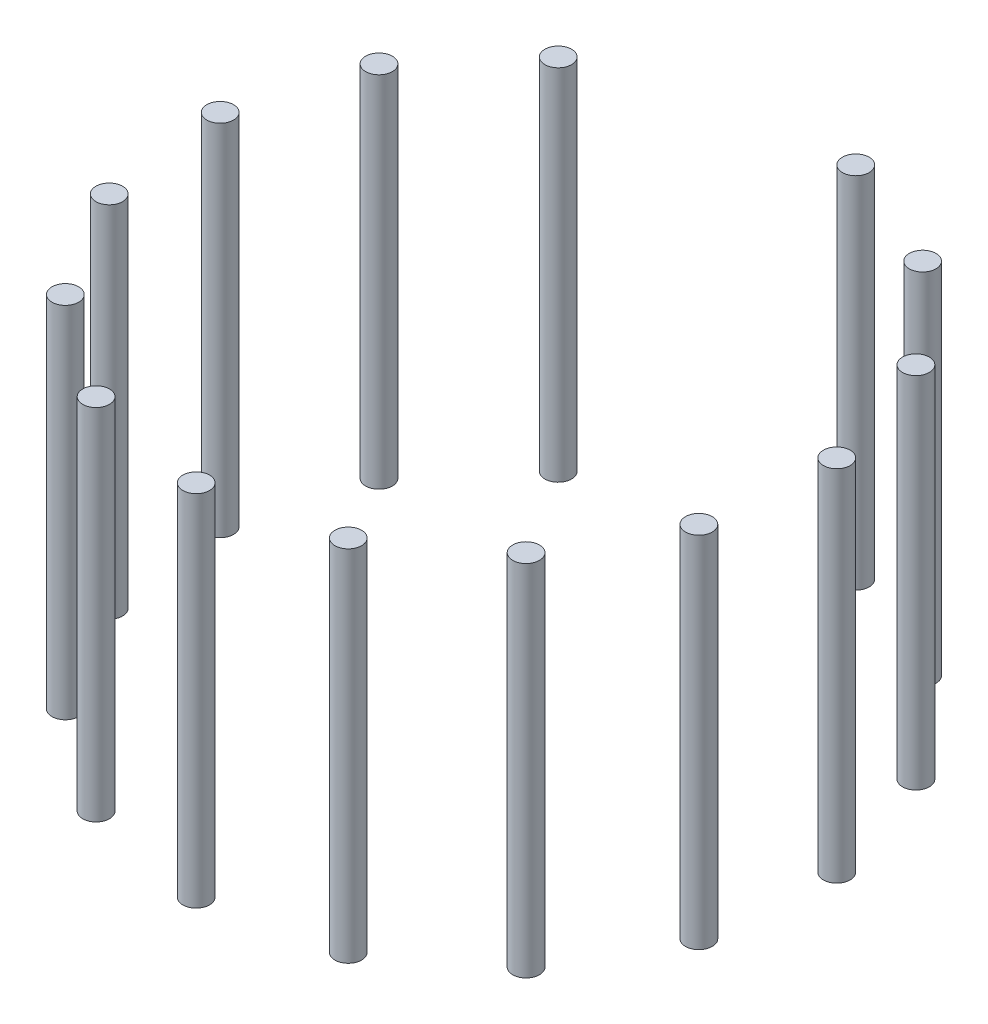
ISO-10303-21;
HEADER;
FILE_DESCRIPTION(('STEP AP214'),'2;1');
FILE_NAME('part.step','',(''),(''),'','','');
FILE_SCHEMA(('AUTOMOTIVE_DESIGN { 1 0 10303 214 1 1 1 1 }'));
ENDSEC;
DATA;
#1=APPLICATION_CONTEXT('core data for automotive mechanical design processes');
#2=APPLICATION_PROTOCOL_DEFINITION('international standard','automotive_design',2000,#1);
#3=PRODUCT_CONTEXT('',#1,'mechanical');
#4=PRODUCT('Part','Part','',(#3));
#5=PRODUCT_RELATED_PRODUCT_CATEGORY('part','',(#4));
#6=PRODUCT_DEFINITION_FORMATION('','',#4);
#7=PRODUCT_DEFINITION_CONTEXT('part definition',#1,'design');
#8=PRODUCT_DEFINITION('design','',#6,#7);
#9=PRODUCT_DEFINITION_SHAPE('','',#8);
#10=(LENGTH_UNIT() NAMED_UNIT(*) SI_UNIT(.MILLI.,.METRE.));
#11=(NAMED_UNIT(*) PLANE_ANGLE_UNIT() SI_UNIT($,.RADIAN.));
#12=(NAMED_UNIT(*) SI_UNIT($,.STERADIAN.) SOLID_ANGLE_UNIT());
#13=UNCERTAINTY_MEASURE_WITH_UNIT(LENGTH_MEASURE(1.E-05),#10,'distance_accuracy_value','');
#14=(GEOMETRIC_REPRESENTATION_CONTEXT(3) GLOBAL_UNCERTAINTY_ASSIGNED_CONTEXT((#13)) GLOBAL_UNIT_ASSIGNED_CONTEXT((#10,
#11,#12)) REPRESENTATION_CONTEXT('',''));
#15=CARTESIAN_POINT('',(0.,0.,0.));
#16=DIRECTION('',(0.,0.,1.));
#17=DIRECTION('',(1.,0.,0.));
#18=AXIS2_PLACEMENT_3D('',#15,#16,#17);
#19=CARTESIAN_POINT('',(8.83217997525082,9.4,-6.67714012740321));
#20=DIRECTION('',(0.,-1.,0.));
#21=DIRECTION('',(0.,0.,-1.));
#22=AXIS2_PLACEMENT_3D('',#19,#20,#21);
#23=CYLINDRICAL_SURFACE('',#22,0.350000000000002);
#24=CARTESIAN_POINT('',(8.83217997525082,9.4,-6.67714012740321));
#25=DIRECTION('',(0.,1.,0.));
#26=DIRECTION('',(0.,0.,1.));
#27=AXIS2_PLACEMENT_3D('',#24,#25,#26);
#28=CIRCLE('',#27,0.350000000000002);
#29=CARTESIAN_POINT('',(8.83217997525082,9.4,-6.3271401274032));
#30=VERTEX_POINT('',#29);
#31=EDGE_CURVE('E11',#30,#30,#28,.T.);
#32=ORIENTED_EDGE('',*,*,#31,.F.);
#33=EDGE_LOOP('',(#32));
#34=FACE_BOUND('',#33,.T.);
#35=CARTESIAN_POINT('',(8.83217997525082,0.,-6.67714012740321));
#36=DIRECTION('',(0.,1.,0.));
#37=DIRECTION('',(0.,0.,1.));
#38=AXIS2_PLACEMENT_3D('',#35,#36,#37);
#39=CIRCLE('',#38,0.350000000000002);
#40=CARTESIAN_POINT('',(8.83217997525082,0.,-6.3271401274032));
#41=VERTEX_POINT('',#40);
#42=EDGE_CURVE('E45',#41,#41,#39,.T.);
#43=ORIENTED_EDGE('',*,*,#42,.T.);
#44=EDGE_LOOP('',(#43));
#45=FACE_BOUND('',#44,.T.);
#46=ADVANCED_FACE('F42',(#34,#45),#23,.T.);
#47=CARTESIAN_POINT('',(8.83217997525082,9.4,-6.67714012740321));
#48=DIRECTION('',(0.,1.,0.));
#49=DIRECTION('',(0.,0.,1.));
#50=AXIS2_PLACEMENT_3D('',#47,#48,#49);
#51=PLANE('',#50);
#52=ORIENTED_EDGE('',*,*,#31,.T.);
#53=EDGE_LOOP('',(#52));
#54=FACE_BOUND('',#53,.T.);
#55=ADVANCED_FACE('F57',(#54),#51,.T.);
#56=CARTESIAN_POINT('',(8.83217997525082,0.,-6.67714012740321));
#57=DIRECTION('',(0.,1.,0.));
#58=DIRECTION('',(0.,0.,1.));
#59=AXIS2_PLACEMENT_3D('',#56,#57,#58);
#60=PLANE('',#59);
#61=ORIENTED_EDGE('',*,*,#42,.F.);
#62=EDGE_LOOP('',(#61));
#63=FACE_BOUND('',#62,.T.);
#64=ADVANCED_FACE('F55',(#63),#60,.F.);
#65=CLOSED_SHELL('',(#46,#55,#64));
#66=MANIFOLD_SOLID_BREP('B2',#65);
#67=CARTESIAN_POINT('',(6.64348952781705,9.4,-4.17198233854852));
#68=DIRECTION('',(0.,-1.,0.));
#69=DIRECTION('',(0.,0.,-1.));
#70=AXIS2_PLACEMENT_3D('',#67,#68,#69);
#71=CYLINDRICAL_SURFACE('',#70,0.350000000000001);
#72=CARTESIAN_POINT('',(6.64348952781705,9.4,-4.17198233854852));
#73=DIRECTION('',(0.,1.,0.));
#74=DIRECTION('',(0.,0.,1.));
#75=AXIS2_PLACEMENT_3D('',#72,#73,#74);
#76=CIRCLE('',#75,0.350000000000001);
#77=CARTESIAN_POINT('',(6.64348952781705,9.4,-3.82198233854852));
#78=VERTEX_POINT('',#77);
#79=EDGE_CURVE('E41',#78,#78,#76,.T.);
#80=ORIENTED_EDGE('',*,*,#79,.F.);
#81=EDGE_LOOP('',(#80));
#82=FACE_BOUND('',#81,.T.);
#83=CARTESIAN_POINT('',(6.64348952781705,0.,-4.17198233854852));
#84=DIRECTION('',(0.,1.,0.));
#85=DIRECTION('',(0.,0.,1.));
#86=AXIS2_PLACEMENT_3D('',#83,#84,#85);
#87=CIRCLE('',#86,0.350000000000001);
#88=CARTESIAN_POINT('',(6.64348952781705,0.,-3.82198233854852));
#89=VERTEX_POINT('',#88);
#90=EDGE_CURVE('E94',#89,#89,#87,.T.);
#91=ORIENTED_EDGE('',*,*,#90,.T.);
#92=EDGE_LOOP('',(#91));
#93=FACE_BOUND('',#92,.T.);
#94=ADVANCED_FACE('F91',(#82,#93),#71,.T.);
#95=CARTESIAN_POINT('',(6.64348952781705,9.4,-4.17198233854852));
#96=DIRECTION('',(0.,1.,0.));
#97=DIRECTION('',(0.,0.,1.));
#98=AXIS2_PLACEMENT_3D('',#95,#96,#97);
#99=PLANE('',#98);
#100=ORIENTED_EDGE('',*,*,#79,.T.);
#101=EDGE_LOOP('',(#100));
#102=FACE_BOUND('',#101,.T.);
#103=ADVANCED_FACE('F106',(#102),#99,.T.);
#104=CARTESIAN_POINT('',(6.64348952781705,0.,-4.17198233854852));
#105=DIRECTION('',(0.,1.,0.));
#106=DIRECTION('',(0.,0.,1.));
#107=AXIS2_PLACEMENT_3D('',#104,#105,#106);
#108=PLANE('',#107);
#109=ORIENTED_EDGE('',*,*,#90,.F.);
#110=EDGE_LOOP('',(#109));
#111=FACE_BOUND('',#110,.T.);
#112=ADVANCED_FACE('F104',(#111),#108,.F.);
#113=CLOSED_SHELL('',(#94,#103,#112));
#114=MANIFOLD_SOLID_BREP('B6',#113);
#115=CARTESIAN_POINT('',(5.66296078079213,9.4,-0.993186214541055));
#116=DIRECTION('',(0.,-1.,0.));
#117=DIRECTION('',(0.,0.,-1.));
#118=AXIS2_PLACEMENT_3D('',#115,#116,#117);
#119=CYLINDRICAL_SURFACE('',#118,0.35);
#120=CARTESIAN_POINT('',(5.66296078079213,9.4,-0.993186214541055));
#121=DIRECTION('',(0.,1.,0.));
#122=DIRECTION('',(0.,0.,1.));
#123=AXIS2_PLACEMENT_3D('',#120,#121,#122);
#124=CIRCLE('',#123,0.35);
#125=CARTESIAN_POINT('',(5.66296078079213,9.4,-0.643186214541055));
#126=VERTEX_POINT('',#125);
#127=EDGE_CURVE('E90',#126,#126,#124,.T.);
#128=ORIENTED_EDGE('',*,*,#127,.F.);
#129=EDGE_LOOP('',(#128));
#130=FACE_BOUND('',#129,.T.);
#131=CARTESIAN_POINT('',(5.66296078079213,0.,-0.993186214541055));
#132=DIRECTION('',(0.,1.,0.));
#133=DIRECTION('',(0.,0.,1.));
#134=AXIS2_PLACEMENT_3D('',#131,#132,#133);
#135=CIRCLE('',#134,0.35);
#136=CARTESIAN_POINT('',(5.66296078079213,0.,-0.643186214541055));
#137=VERTEX_POINT('',#136);
#138=EDGE_CURVE('E143',#137,#137,#135,.T.);
#139=ORIENTED_EDGE('',*,*,#138,.T.);
#140=EDGE_LOOP('',(#139));
#141=FACE_BOUND('',#140,.T.);
#142=ADVANCED_FACE('F140',(#130,#141),#119,.T.);
#143=CARTESIAN_POINT('',(5.66296078079213,9.4,-0.993186214541055));
#144=DIRECTION('',(0.,1.,0.));
#145=DIRECTION('',(0.,0.,1.));
#146=AXIS2_PLACEMENT_3D('',#143,#144,#145);
#147=PLANE('',#146);
#148=ORIENTED_EDGE('',*,*,#127,.T.);
#149=EDGE_LOOP('',(#148));
#150=FACE_BOUND('',#149,.T.);
#151=ADVANCED_FACE('F155',(#150),#147,.T.);
#152=CARTESIAN_POINT('',(5.66296078079213,0.,-0.993186214541055));
#153=DIRECTION('',(0.,1.,0.));
#154=DIRECTION('',(0.,0.,1.));
#155=AXIS2_PLACEMENT_3D('',#152,#153,#154);
#156=PLANE('',#155);
#157=ORIENTED_EDGE('',*,*,#138,.F.);
#158=EDGE_LOOP('',(#157));
#159=FACE_BOUND('',#158,.T.);
#160=ADVANCED_FACE('F153',(#159),#156,.F.);
#161=CLOSED_SHELL('',(#142,#151,#160));
#162=MANIFOLD_SOLID_BREP('B36',#161);
#163=CARTESIAN_POINT('',(6.06013606236068,9.4,2.3096055163221));
#164=DIRECTION('',(0.,-1.,0.));
#165=DIRECTION('',(0.,0.,-1.));
#166=AXIS2_PLACEMENT_3D('',#163,#164,#165);
#167=CYLINDRICAL_SURFACE('',#166,0.35);
#168=CARTESIAN_POINT('',(6.06013606236068,9.4,2.3096055163221));
#169=DIRECTION('',(0.,1.,0.));
#170=DIRECTION('',(0.,0.,1.));
#171=AXIS2_PLACEMENT_3D('',#168,#169,#170);
#172=CIRCLE('',#171,0.35);
#173=CARTESIAN_POINT('',(6.06013606236068,9.4,2.6596055163221));
#174=VERTEX_POINT('',#173);
#175=EDGE_CURVE('E139',#174,#174,#172,.T.);
#176=ORIENTED_EDGE('',*,*,#175,.F.);
#177=EDGE_LOOP('',(#176));
#178=FACE_BOUND('',#177,.T.);
#179=CARTESIAN_POINT('',(6.06013606236068,0.,2.3096055163221));
#180=DIRECTION('',(0.,1.,0.));
#181=DIRECTION('',(0.,0.,1.));
#182=AXIS2_PLACEMENT_3D('',#179,#180,#181);
#183=CIRCLE('',#182,0.35);
#184=CARTESIAN_POINT('',(6.06013606236068,0.,2.6596055163221));
#185=VERTEX_POINT('',#184);
#186=EDGE_CURVE('E192',#185,#185,#183,.T.);
#187=ORIENTED_EDGE('',*,*,#186,.T.);
#188=EDGE_LOOP('',(#187));
#189=FACE_BOUND('',#188,.T.);
#190=ADVANCED_FACE('F189',(#178,#189),#167,.T.);
#191=CARTESIAN_POINT('',(6.06013606236068,9.4,2.3096055163221));
#192=DIRECTION('',(0.,1.,0.));
#193=DIRECTION('',(0.,0.,1.));
#194=AXIS2_PLACEMENT_3D('',#191,#192,#193);
#195=PLANE('',#194);
#196=ORIENTED_EDGE('',*,*,#175,.T.);
#197=EDGE_LOOP('',(#196));
#198=FACE_BOUND('',#197,.T.);
#199=ADVANCED_FACE('F204',(#198),#195,.T.);
#200=CARTESIAN_POINT('',(6.06013606236068,0.,2.3096055163221));
#201=DIRECTION('',(0.,1.,0.));
#202=DIRECTION('',(0.,0.,1.));
#203=AXIS2_PLACEMENT_3D('',#200,#201,#202);
#204=PLANE('',#203);
#205=ORIENTED_EDGE('',*,*,#186,.F.);
#206=EDGE_LOOP('',(#205));
#207=FACE_BOUND('',#206,.T.);
#208=ADVANCED_FACE('F202',(#207),#204,.F.);
#209=CLOSED_SHELL('',(#190,#199,#208));
#210=MANIFOLD_SOLID_BREP('B85',#209);
#211=CARTESIAN_POINT('',(7.76634015811535,9.4,5.1653101588538));
#212=DIRECTION('',(0.,-1.,0.));
#213=DIRECTION('',(0.,0.,-1.));
#214=AXIS2_PLACEMENT_3D('',#211,#212,#213);
#215=CYLINDRICAL_SURFACE('',#214,0.349999999999999);
#216=CARTESIAN_POINT('',(7.76634015811535,9.4,5.1653101588538));
#217=DIRECTION('',(0.,1.,0.));
#218=DIRECTION('',(0.,0.,1.));
#219=AXIS2_PLACEMENT_3D('',#216,#217,#218);
#220=CIRCLE('',#219,0.349999999999999);
#221=CARTESIAN_POINT('',(7.76634015811535,9.4,5.5153101588538));
#222=VERTEX_POINT('',#221);
#223=EDGE_CURVE('E188',#222,#222,#220,.T.);
#224=ORIENTED_EDGE('',*,*,#223,.F.);
#225=EDGE_LOOP('',(#224));
#226=FACE_BOUND('',#225,.T.);
#227=CARTESIAN_POINT('',(7.76634015811535,0.,5.1653101588538));
#228=DIRECTION('',(0.,1.,0.));
#229=DIRECTION('',(0.,0.,1.));
#230=AXIS2_PLACEMENT_3D('',#227,#228,#229);
#231=CIRCLE('',#230,0.349999999999999);
#232=CARTESIAN_POINT('',(7.76634015811535,0.,5.5153101588538));
#233=VERTEX_POINT('',#232);
#234=EDGE_CURVE('E241',#233,#233,#231,.T.);
#235=ORIENTED_EDGE('',*,*,#234,.T.);
#236=EDGE_LOOP('',(#235));
#237=FACE_BOUND('',#236,.T.);
#238=ADVANCED_FACE('F238',(#226,#237),#215,.T.);
#239=CARTESIAN_POINT('',(7.76634015811535,9.4,5.1653101588538));
#240=DIRECTION('',(0.,1.,0.));
#241=DIRECTION('',(0.,0.,1.));
#242=AXIS2_PLACEMENT_3D('',#239,#240,#241);
#243=PLANE('',#242);
#244=ORIENTED_EDGE('',*,*,#223,.T.);
#245=EDGE_LOOP('',(#244));
#246=FACE_BOUND('',#245,.T.);
#247=ADVANCED_FACE('F253',(#246),#243,.T.);
#248=CARTESIAN_POINT('',(7.76634015811535,0.,5.1653101588538));
#249=DIRECTION('',(0.,1.,0.));
#250=DIRECTION('',(0.,0.,1.));
#251=AXIS2_PLACEMENT_3D('',#248,#249,#250);
#252=PLANE('',#251);
#253=ORIENTED_EDGE('',*,*,#234,.F.);
#254=EDGE_LOOP('',(#253));
#255=FACE_BOUND('',#254,.T.);
#256=ADVANCED_FACE('F251',(#255),#252,.F.);
#257=CLOSED_SHELL('',(#238,#247,#256));
#258=MANIFOLD_SOLID_BREP('B134',#257);
#259=CARTESIAN_POINT('',(10.4865548795226,9.4,7.08015043709809));
#260=DIRECTION('',(0.,-1.,0.));
#261=DIRECTION('',(0.,0.,-1.));
#262=AXIS2_PLACEMENT_3D('',#259,#260,#261);
#263=CYLINDRICAL_SURFACE('',#262,0.35);
#264=CARTESIAN_POINT('',(10.4865548795226,9.4,7.08015043709809));
#265=DIRECTION('',(0.,1.,0.));
#266=DIRECTION('',(0.,0.,1.));
#267=AXIS2_PLACEMENT_3D('',#264,#265,#266);
#268=CIRCLE('',#267,0.35);
#269=CARTESIAN_POINT('',(10.4865548795226,9.4,7.43015043709809));
#270=VERTEX_POINT('',#269);
#271=EDGE_CURVE('E237',#270,#270,#268,.T.);
#272=ORIENTED_EDGE('',*,*,#271,.F.);
#273=EDGE_LOOP('',(#272));
#274=FACE_BOUND('',#273,.T.);
#275=CARTESIAN_POINT('',(10.4865548795226,0.,7.08015043709809));
#276=DIRECTION('',(0.,1.,0.));
#277=DIRECTION('',(0.,0.,1.));
#278=AXIS2_PLACEMENT_3D('',#275,#276,#277);
#279=CIRCLE('',#278,0.35);
#280=CARTESIAN_POINT('',(10.4865548795226,0.,7.43015043709809));
#281=VERTEX_POINT('',#280);
#282=EDGE_CURVE('E290',#281,#281,#279,.T.);
#283=ORIENTED_EDGE('',*,*,#282,.T.);
#284=EDGE_LOOP('',(#283));
#285=FACE_BOUND('',#284,.T.);
#286=ADVANCED_FACE('F287',(#274,#285),#263,.T.);
#287=CARTESIAN_POINT('',(10.4865548795226,9.4,7.08015043709809));
#288=DIRECTION('',(0.,1.,0.));
#289=DIRECTION('',(0.,0.,1.));
#290=AXIS2_PLACEMENT_3D('',#287,#288,#289);
#291=PLANE('',#290);
#292=ORIENTED_EDGE('',*,*,#271,.T.);
#293=EDGE_LOOP('',(#292));
#294=FACE_BOUND('',#293,.T.);
#295=ADVANCED_FACE('F302',(#294),#291,.T.);
#296=CARTESIAN_POINT('',(10.4865548795226,0.,7.08015043709809));
#297=DIRECTION('',(0.,1.,0.));
#298=DIRECTION('',(0.,0.,1.));
#299=AXIS2_PLACEMENT_3D('',#296,#297,#298);
#300=PLANE('',#299);
#301=ORIENTED_EDGE('',*,*,#282,.F.);
#302=EDGE_LOOP('',(#301));
#303=FACE_BOUND('',#302,.T.);
#304=ADVANCED_FACE('F300',(#303),#300,.F.);
#305=CLOSED_SHELL('',(#286,#295,#304));
#306=MANIFOLD_SOLID_BREP('B183',#305);
#307=CARTESIAN_POINT('',(13.7504303888761,9.4,7.72303307116871));
#308=DIRECTION('',(0.,-1.,0.));
#309=DIRECTION('',(0.,0.,-1.));
#310=AXIS2_PLACEMENT_3D('',#307,#308,#309);
#311=CYLINDRICAL_SURFACE('',#310,0.349999999999999);
#312=CARTESIAN_POINT('',(13.7504303888761,9.4,7.72303307116871));
#313=DIRECTION('',(0.,1.,0.));
#314=DIRECTION('',(0.,0.,1.));
#315=AXIS2_PLACEMENT_3D('',#312,#313,#314);
#316=CIRCLE('',#315,0.349999999999999);
#317=CARTESIAN_POINT('',(13.7504303888761,9.4,8.07303307116871));
#318=VERTEX_POINT('',#317);
#319=EDGE_CURVE('E286',#318,#318,#316,.T.);
#320=ORIENTED_EDGE('',*,*,#319,.F.);
#321=EDGE_LOOP('',(#320));
#322=FACE_BOUND('',#321,.T.);
#323=CARTESIAN_POINT('',(13.7504303888761,0.,7.72303307116871));
#324=DIRECTION('',(0.,1.,0.));
#325=DIRECTION('',(0.,0.,1.));
#326=AXIS2_PLACEMENT_3D('',#323,#324,#325);
#327=CIRCLE('',#326,0.349999999999999);
#328=CARTESIAN_POINT('',(13.7504303888761,0.,8.07303307116871));
#329=VERTEX_POINT('',#328);
#330=EDGE_CURVE('E339',#329,#329,#327,.T.);
#331=ORIENTED_EDGE('',*,*,#330,.T.);
#332=EDGE_LOOP('',(#331));
#333=FACE_BOUND('',#332,.T.);
#334=ADVANCED_FACE('F336',(#322,#333),#311,.T.);
#335=CARTESIAN_POINT('',(13.7504303888761,9.4,7.72303307116871));
#336=DIRECTION('',(0.,1.,0.));
#337=DIRECTION('',(0.,0.,1.));
#338=AXIS2_PLACEMENT_3D('',#335,#336,#337);
#339=PLANE('',#338);
#340=ORIENTED_EDGE('',*,*,#319,.T.);
#341=EDGE_LOOP('',(#340));
#342=FACE_BOUND('',#341,.T.);
#343=ADVANCED_FACE('F351',(#342),#339,.T.);
#344=CARTESIAN_POINT('',(13.7504303888761,0.,7.72303307116871));
#345=DIRECTION('',(0.,1.,0.));
#346=DIRECTION('',(0.,0.,1.));
#347=AXIS2_PLACEMENT_3D('',#344,#345,#346);
#348=PLANE('',#347);
#349=ORIENTED_EDGE('',*,*,#330,.F.);
#350=EDGE_LOOP('',(#349));
#351=FACE_BOUND('',#350,.T.);
#352=ADVANCED_FACE('F349',(#351),#348,.F.);
#353=CLOSED_SHELL('',(#334,#343,#352));
#354=MANIFOLD_SOLID_BREP('B232',#353);
#355=CARTESIAN_POINT('',(16.9936129592305,9.4,6.98279781322947));
#356=DIRECTION('',(0.,-1.,0.));
#357=DIRECTION('',(0.,0.,-1.));
#358=AXIS2_PLACEMENT_3D('',#355,#356,#357);
#359=CYLINDRICAL_SURFACE('',#358,0.350000000000003);
#360=CARTESIAN_POINT('',(16.9936129592305,9.4,6.98279781322947));
#361=DIRECTION('',(0.,1.,0.));
#362=DIRECTION('',(0.,0.,1.));
#363=AXIS2_PLACEMENT_3D('',#360,#361,#362);
#364=CIRCLE('',#363,0.350000000000003);
#365=CARTESIAN_POINT('',(16.9936129592305,9.4,7.33279781322947));
#366=VERTEX_POINT('',#365);
#367=EDGE_CURVE('E335',#366,#366,#364,.T.);
#368=ORIENTED_EDGE('',*,*,#367,.F.);
#369=EDGE_LOOP('',(#368));
#370=FACE_BOUND('',#369,.T.);
#371=CARTESIAN_POINT('',(16.9936129592305,0.,6.98279781322947));
#372=DIRECTION('',(0.,1.,0.));
#373=DIRECTION('',(0.,0.,1.));
#374=AXIS2_PLACEMENT_3D('',#371,#372,#373);
#375=CIRCLE('',#374,0.350000000000003);
#376=CARTESIAN_POINT('',(16.9936129592305,0.,7.33279781322947));
#377=VERTEX_POINT('',#376);
#378=EDGE_CURVE('E388',#377,#377,#375,.T.);
#379=ORIENTED_EDGE('',*,*,#378,.T.);
#380=EDGE_LOOP('',(#379));
#381=FACE_BOUND('',#380,.T.);
#382=ADVANCED_FACE('F385',(#370,#381),#359,.T.);
#383=CARTESIAN_POINT('',(16.9936129592305,9.4,6.98279781322947));
#384=DIRECTION('',(0.,1.,0.));
#385=DIRECTION('',(0.,0.,1.));
#386=AXIS2_PLACEMENT_3D('',#383,#384,#385);
#387=PLANE('',#386);
#388=ORIENTED_EDGE('',*,*,#367,.T.);
#389=EDGE_LOOP('',(#388));
#390=FACE_BOUND('',#389,.T.);
#391=ADVANCED_FACE('F400',(#390),#387,.T.);
#392=CARTESIAN_POINT('',(16.9936129592305,0.,6.98279781322947));
#393=DIRECTION('',(0.,1.,0.));
#394=DIRECTION('',(0.,0.,1.));
#395=AXIS2_PLACEMENT_3D('',#392,#393,#394);
#396=PLANE('',#395);
#397=ORIENTED_EDGE('',*,*,#378,.F.);
#398=EDGE_LOOP('',(#397));
#399=FACE_BOUND('',#398,.T.);
#400=ADVANCED_FACE('F398',(#399),#396,.F.);
#401=CLOSED_SHELL('',(#382,#391,#400));
#402=MANIFOLD_SOLID_BREP('B281',#401);
#403=CARTESIAN_POINT('',(19.6553268607829,9.4,4.98743806420427));
#404=DIRECTION('',(0.,-1.,0.));
#405=DIRECTION('',(0.,0.,-1.));
#406=AXIS2_PLACEMENT_3D('',#403,#404,#405);
#407=CYLINDRICAL_SURFACE('',#406,0.349999999999999);
#408=CARTESIAN_POINT('',(19.6553268607829,9.4,4.98743806420427));
#409=DIRECTION('',(0.,1.,0.));
#410=DIRECTION('',(0.,0.,1.));
#411=AXIS2_PLACEMENT_3D('',#408,#409,#410);
#412=CIRCLE('',#411,0.349999999999999);
#413=CARTESIAN_POINT('',(19.6553268607829,9.4,5.33743806420427));
#414=VERTEX_POINT('',#413);
#415=EDGE_CURVE('E384',#414,#414,#412,.T.);
#416=ORIENTED_EDGE('',*,*,#415,.F.);
#417=EDGE_LOOP('',(#416));
#418=FACE_BOUND('',#417,.T.);
#419=CARTESIAN_POINT('',(19.6553268607829,0.,4.98743806420427));
#420=DIRECTION('',(0.,1.,0.));
#421=DIRECTION('',(0.,0.,1.));
#422=AXIS2_PLACEMENT_3D('',#419,#420,#421);
#423=CIRCLE('',#422,0.349999999999999);
#424=CARTESIAN_POINT('',(19.6553268607829,0.,5.33743806420427));
#425=VERTEX_POINT('',#424);
#426=EDGE_CURVE('E437',#425,#425,#423,.T.);
#427=ORIENTED_EDGE('',*,*,#426,.T.);
#428=EDGE_LOOP('',(#427));
#429=FACE_BOUND('',#428,.T.);
#430=ADVANCED_FACE('F434',(#418,#429),#407,.T.);
#431=CARTESIAN_POINT('',(19.6553268607829,9.4,4.98743806420427));
#432=DIRECTION('',(0.,1.,0.));
#433=DIRECTION('',(0.,0.,1.));
#434=AXIS2_PLACEMENT_3D('',#431,#432,#433);
#435=PLANE('',#434);
#436=ORIENTED_EDGE('',*,*,#415,.T.);
#437=EDGE_LOOP('',(#436));
#438=FACE_BOUND('',#437,.T.);
#439=ADVANCED_FACE('F449',(#438),#435,.T.);
#440=CARTESIAN_POINT('',(19.6553268607829,0.,4.98743806420427));
#441=DIRECTION('',(0.,1.,0.));
#442=DIRECTION('',(0.,0.,1.));
#443=AXIS2_PLACEMENT_3D('',#440,#441,#442);
#444=PLANE('',#443);
#445=ORIENTED_EDGE('',*,*,#426,.F.);
#446=EDGE_LOOP('',(#445));
#447=FACE_BOUND('',#446,.T.);
#448=ADVANCED_FACE('F447',(#447),#444,.F.);
#449=CLOSED_SHELL('',(#430,#439,#448));
#450=MANIFOLD_SOLID_BREP('B330',#449);
#451=CARTESIAN_POINT('',(21.2753375790431,9.4,2.08196965197382));
#452=DIRECTION('',(0.,-1.,0.));
#453=DIRECTION('',(0.,0.,-1.));
#454=AXIS2_PLACEMENT_3D('',#451,#452,#453);
#455=CYLINDRICAL_SURFACE('',#454,0.35);
#456=CARTESIAN_POINT('',(21.2753375790431,9.4,2.08196965197382));
#457=DIRECTION('',(0.,1.,0.));
#458=DIRECTION('',(0.,0.,1.));
#459=AXIS2_PLACEMENT_3D('',#456,#457,#458);
#460=CIRCLE('',#459,0.35);
#461=CARTESIAN_POINT('',(21.2753375790431,9.4,2.43196965197381));
#462=VERTEX_POINT('',#461);
#463=EDGE_CURVE('E433',#462,#462,#460,.T.);
#464=ORIENTED_EDGE('',*,*,#463,.F.);
#465=EDGE_LOOP('',(#464));
#466=FACE_BOUND('',#465,.T.);
#467=CARTESIAN_POINT('',(21.2753375790431,0.,2.08196965197382));
#468=DIRECTION('',(0.,1.,0.));
#469=DIRECTION('',(0.,0.,1.));
#470=AXIS2_PLACEMENT_3D('',#467,#468,#469);
#471=CIRCLE('',#470,0.35);
#472=CARTESIAN_POINT('',(21.2753375790431,0.,2.43196965197381));
#473=VERTEX_POINT('',#472);
#474=EDGE_CURVE('E486',#473,#473,#471,.T.);
#475=ORIENTED_EDGE('',*,*,#474,.T.);
#476=EDGE_LOOP('',(#475));
#477=FACE_BOUND('',#476,.T.);
#478=ADVANCED_FACE('F483',(#466,#477),#455,.T.);
#479=CARTESIAN_POINT('',(21.2753375790431,9.4,2.08196965197382));
#480=DIRECTION('',(0.,1.,0.));
#481=DIRECTION('',(0.,0.,1.));
#482=AXIS2_PLACEMENT_3D('',#479,#480,#481);
#483=PLANE('',#482);
#484=ORIENTED_EDGE('',*,*,#463,.T.);
#485=EDGE_LOOP('',(#484));
#486=FACE_BOUND('',#485,.T.);
#487=ADVANCED_FACE('F498',(#486),#483,.T.);
#488=CARTESIAN_POINT('',(21.2753375790431,0.,2.08196965197382));
#489=DIRECTION('',(0.,1.,0.));
#490=DIRECTION('',(0.,0.,1.));
#491=AXIS2_PLACEMENT_3D('',#488,#489,#490);
#492=PLANE('',#491);
#493=ORIENTED_EDGE('',*,*,#474,.F.);
#494=EDGE_LOOP('',(#493));
#495=FACE_BOUND('',#494,.T.);
#496=ADVANCED_FACE('F496',(#495),#492,.F.);
#497=CLOSED_SHELL('',(#478,#487,#496));
#498=MANIFOLD_SOLID_BREP('B379',#497);
#499=CARTESIAN_POINT('',(21.5735305434887,9.4,-1.23122553963538));
#500=DIRECTION('',(0.,-1.,0.));
#501=DIRECTION('',(0.,0.,-1.));
#502=AXIS2_PLACEMENT_3D('',#499,#500,#501);
#503=CYLINDRICAL_SURFACE('',#502,0.35);
#504=CARTESIAN_POINT('',(21.5735305434887,9.4,-1.23122553963538));
#505=DIRECTION('',(0.,1.,0.));
#506=DIRECTION('',(0.,0.,1.));
#507=AXIS2_PLACEMENT_3D('',#504,#505,#506);
#508=CIRCLE('',#507,0.35);
#509=CARTESIAN_POINT('',(21.5735305434887,9.4,-0.881225539635381));
#510=VERTEX_POINT('',#509);
#511=EDGE_CURVE('E482',#510,#510,#508,.T.);
#512=ORIENTED_EDGE('',*,*,#511,.F.);
#513=EDGE_LOOP('',(#512));
#514=FACE_BOUND('',#513,.T.);
#515=CARTESIAN_POINT('',(21.5735305434887,0.,-1.23122553963538));
#516=DIRECTION('',(0.,1.,0.));
#517=DIRECTION('',(0.,0.,1.));
#518=AXIS2_PLACEMENT_3D('',#515,#516,#517);
#519=CIRCLE('',#518,0.35);
#520=CARTESIAN_POINT('',(21.5735305434887,0.,-0.881225539635381));
#521=VERTEX_POINT('',#520);
#522=EDGE_CURVE('E535',#521,#521,#519,.T.);
#523=ORIENTED_EDGE('',*,*,#522,.T.);
#524=EDGE_LOOP('',(#523));
#525=FACE_BOUND('',#524,.T.);
#526=ADVANCED_FACE('F532',(#514,#525),#503,.T.);
#527=CARTESIAN_POINT('',(21.5735305434887,9.4,-1.23122553963538));
#528=DIRECTION('',(0.,1.,0.));
#529=DIRECTION('',(0.,0.,1.));
#530=AXIS2_PLACEMENT_3D('',#527,#528,#529);
#531=PLANE('',#530);
#532=ORIENTED_EDGE('',*,*,#511,.T.);
#533=EDGE_LOOP('',(#532));
#534=FACE_BOUND('',#533,.T.);
#535=ADVANCED_FACE('F547',(#534),#531,.T.);
#536=CARTESIAN_POINT('',(21.5735305434887,0.,-1.23122553963538));
#537=DIRECTION('',(0.,1.,0.));
#538=DIRECTION('',(0.,0.,1.));
#539=AXIS2_PLACEMENT_3D('',#536,#537,#538);
#540=PLANE('',#539);
#541=ORIENTED_EDGE('',*,*,#522,.F.);
#542=EDGE_LOOP('',(#541));
#543=FACE_BOUND('',#542,.T.);
#544=ADVANCED_FACE('F545',(#543),#540,.F.);
#545=CLOSED_SHELL('',(#526,#535,#544));
#546=MANIFOLD_SOLID_BREP('B428',#545);
#547=CARTESIAN_POINT('',(20.498345481569,9.4,-4.37926596256069));
#548=DIRECTION('',(0.,-1.,0.));
#549=DIRECTION('',(0.,0.,-1.));
#550=AXIS2_PLACEMENT_3D('',#547,#548,#549);
#551=CYLINDRICAL_SURFACE('',#550,0.349999999999998);
#552=CARTESIAN_POINT('',(20.498345481569,9.4,-4.37926596256069));
#553=DIRECTION('',(0.,1.,0.));
#554=DIRECTION('',(0.,0.,1.));
#555=AXIS2_PLACEMENT_3D('',#552,#553,#554);
#556=CIRCLE('',#555,0.349999999999998);
#557=CARTESIAN_POINT('',(20.498345481569,9.4,-4.02926596256069));
#558=VERTEX_POINT('',#557);
#559=EDGE_CURVE('E531',#558,#558,#556,.T.);
#560=ORIENTED_EDGE('',*,*,#559,.F.);
#561=EDGE_LOOP('',(#560));
#562=FACE_BOUND('',#561,.T.);
#563=CARTESIAN_POINT('',(20.498345481569,0.,-4.37926596256069));
#564=DIRECTION('',(0.,1.,0.));
#565=DIRECTION('',(0.,0.,1.));
#566=AXIS2_PLACEMENT_3D('',#563,#564,#565);
#567=CIRCLE('',#566,0.349999999999998);
#568=CARTESIAN_POINT('',(20.498345481569,0.,-4.02926596256069));
#569=VERTEX_POINT('',#568);
#570=EDGE_CURVE('E584',#569,#569,#567,.T.);
#571=ORIENTED_EDGE('',*,*,#570,.T.);
#572=EDGE_LOOP('',(#571));
#573=FACE_BOUND('',#572,.T.);
#574=ADVANCED_FACE('F581',(#562,#573),#551,.T.);
#575=CARTESIAN_POINT('',(20.498345481569,9.4,-4.37926596256069));
#576=DIRECTION('',(0.,1.,0.));
#577=DIRECTION('',(0.,0.,1.));
#578=AXIS2_PLACEMENT_3D('',#575,#576,#577);
#579=PLANE('',#578);
#580=ORIENTED_EDGE('',*,*,#559,.T.);
#581=EDGE_LOOP('',(#580));
#582=FACE_BOUND('',#581,.T.);
#583=ADVANCED_FACE('F596',(#582),#579,.T.);
#584=CARTESIAN_POINT('',(20.498345481569,0.,-4.37926596256069));
#585=DIRECTION('',(0.,1.,0.));
#586=DIRECTION('',(0.,0.,1.));
#587=AXIS2_PLACEMENT_3D('',#584,#585,#586);
#588=PLANE('',#587);
#589=ORIENTED_EDGE('',*,*,#570,.F.);
#590=EDGE_LOOP('',(#589));
#591=FACE_BOUND('',#590,.T.);
#592=ADVANCED_FACE('F594',(#591),#588,.F.);
#593=CLOSED_SHELL('',(#574,#583,#592));
#594=MANIFOLD_SOLID_BREP('B477',#593);
#595=CARTESIAN_POINT('',(18.2356916582395,9.4,-6.81782682862891));
#596=DIRECTION('',(0.,-1.,0.));
#597=DIRECTION('',(0.,0.,-1.));
#598=AXIS2_PLACEMENT_3D('',#595,#596,#597);
#599=CYLINDRICAL_SURFACE('',#598,0.350000000000001);
#600=CARTESIAN_POINT('',(18.2356916582395,9.4,-6.81782682862891));
#601=DIRECTION('',(0.,1.,0.));
#602=DIRECTION('',(0.,0.,1.));
#603=AXIS2_PLACEMENT_3D('',#600,#601,#602);
#604=CIRCLE('',#603,0.350000000000001);
#605=CARTESIAN_POINT('',(18.2356916582395,9.4,-6.46782682862891));
#606=VERTEX_POINT('',#605);
#607=EDGE_CURVE('E580',#606,#606,#604,.T.);
#608=ORIENTED_EDGE('',*,*,#607,.F.);
#609=EDGE_LOOP('',(#608));
#610=FACE_BOUND('',#609,.T.);
#611=CARTESIAN_POINT('',(18.2356916582395,0.,-6.81782682862891));
#612=DIRECTION('',(0.,1.,0.));
#613=DIRECTION('',(0.,0.,1.));
#614=AXIS2_PLACEMENT_3D('',#611,#612,#613);
#615=CIRCLE('',#614,0.350000000000001);
#616=CARTESIAN_POINT('',(18.2356916582395,0.,-6.46782682862891));
#617=VERTEX_POINT('',#616);
#618=EDGE_CURVE('E632',#617,#617,#615,.T.);
#619=ORIENTED_EDGE('',*,*,#618,.T.);
#620=EDGE_LOOP('',(#619));
#621=FACE_BOUND('',#620,.T.);
#622=ADVANCED_FACE('F629',(#610,#621),#599,.T.);
#623=CARTESIAN_POINT('',(18.2356916582395,9.4,-6.81782682862891));
#624=DIRECTION('',(0.,1.,0.));
#625=DIRECTION('',(0.,0.,1.));
#626=AXIS2_PLACEMENT_3D('',#623,#624,#625);
#627=PLANE('',#626);
#628=ORIENTED_EDGE('',*,*,#607,.T.);
#629=EDGE_LOOP('',(#628));
#630=FACE_BOUND('',#629,.T.);
#631=ADVANCED_FACE('F644',(#630),#627,.T.);
#632=CARTESIAN_POINT('',(18.2356916582395,0.,-6.81782682862891));
#633=DIRECTION('',(0.,1.,0.));
#634=DIRECTION('',(0.,0.,1.));
#635=AXIS2_PLACEMENT_3D('',#632,#633,#634);
#636=PLANE('',#635);
#637=ORIENTED_EDGE('',*,*,#618,.F.);
#638=EDGE_LOOP('',(#637));
#639=FACE_BOUND('',#638,.T.);
#640=ADVANCED_FACE('F642',(#639),#636,.F.);
#641=CLOSED_SHELL('',(#622,#631,#640));
#642=MANIFOLD_SOLID_BREP('B526',#641);
#643=CARTESIAN_POINT('',(15.1768024751185,9.4,-8.12525881046685));
#644=DIRECTION('',(0.,-1.,0.));
#645=DIRECTION('',(0.,0.,-1.));
#646=AXIS2_PLACEMENT_3D('',#643,#644,#645);
#647=CYLINDRICAL_SURFACE('',#646,0.350000000000001);
#648=CARTESIAN_POINT('',(15.1768024751185,9.4,-8.12525881046685));
#649=DIRECTION('',(0.,1.,0.));
#650=DIRECTION('',(0.,0.,1.));
#651=AXIS2_PLACEMENT_3D('',#648,#649,#650);
#652=CIRCLE('',#651,0.350000000000001);
#653=CARTESIAN_POINT('',(15.1768024751185,9.4,-7.77525881046685));
#654=VERTEX_POINT('',#653);
#655=EDGE_CURVE('E628',#654,#654,#652,.T.);
#656=ORIENTED_EDGE('',*,*,#655,.F.);
#657=EDGE_LOOP('',(#656));
#658=FACE_BOUND('',#657,.T.);
#659=CARTESIAN_POINT('',(15.1768024751185,0.,-8.12525881046685));
#660=DIRECTION('',(0.,1.,0.));
#661=DIRECTION('',(0.,0.,1.));
#662=AXIS2_PLACEMENT_3D('',#659,#660,#661);
#663=CIRCLE('',#662,0.350000000000001);
#664=CARTESIAN_POINT('',(15.1768024751185,0.,-7.77525881046685));
#665=VERTEX_POINT('',#664);
#666=EDGE_CURVE('E673',#665,#665,#663,.T.);
#667=ORIENTED_EDGE('',*,*,#666,.T.);
#668=EDGE_LOOP('',(#667));
#669=FACE_BOUND('',#668,.T.);
#670=ADVANCED_FACE('F670',(#658,#669),#647,.T.);
#671=CARTESIAN_POINT('',(15.1768024751185,9.4,-8.12525881046685));
#672=DIRECTION('',(0.,1.,0.));
#673=DIRECTION('',(0.,0.,1.));
#674=AXIS2_PLACEMENT_3D('',#671,#672,#673);
#675=PLANE('',#674);
#676=ORIENTED_EDGE('',*,*,#655,.T.);
#677=EDGE_LOOP('',(#676));
#678=FACE_BOUND('',#677,.T.);
#679=ADVANCED_FACE('F685',(#678),#675,.T.);
#680=CARTESIAN_POINT('',(15.1768024751185,0.,-8.12525881046685));
#681=DIRECTION('',(0.,1.,0.));
#682=DIRECTION('',(0.,0.,1.));
#683=AXIS2_PLACEMENT_3D('',#680,#681,#682);
#684=PLANE('',#683);
#685=ORIENTED_EDGE('',*,*,#666,.F.);
#686=EDGE_LOOP('',(#685));
#687=FACE_BOUND('',#686,.T.);
#688=ADVANCED_FACE('F683',(#687),#684,.F.);
#689=CLOSED_SHELL('',(#670,#679,#688));
#690=MANIFOLD_SOLID_BREP('B575',#689);
#691=ADVANCED_BREP_SHAPE_REPRESENTATION('',(#18,#66,#114,#162,#210,#258,#306,#354,#402,#450,
#498,#546,#594,#642,#690),#14);
#692=SHAPE_DEFINITION_REPRESENTATION(#9,#691);
ENDSEC;
END-ISO-10303-21;
